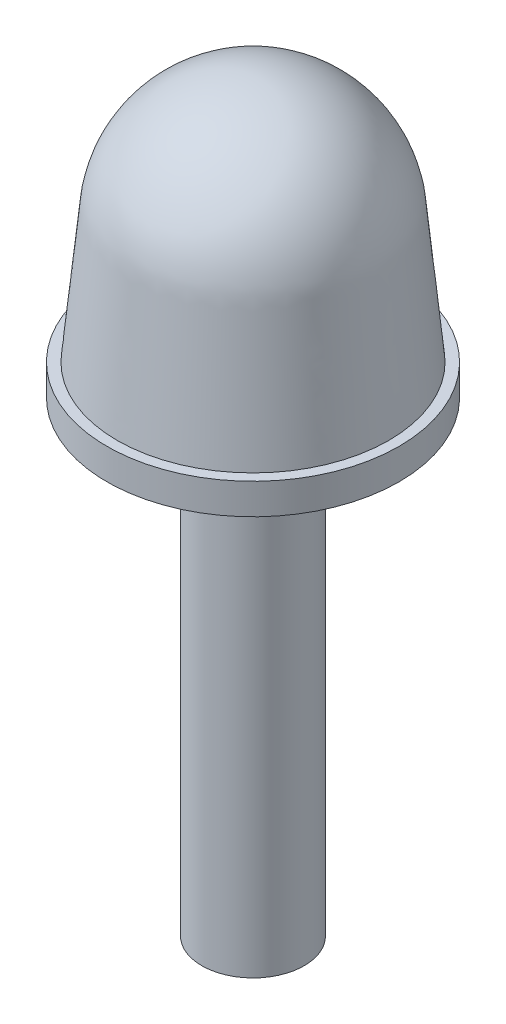
ISO-10303-21;
HEADER;
FILE_DESCRIPTION(('STEP AP214'),'2;1');
FILE_NAME('part.step','',(''),(''),'','','');
FILE_SCHEMA(('AUTOMOTIVE_DESIGN { 1 0 10303 214 1 1 1 1 }'));
ENDSEC;
DATA;
#1=APPLICATION_CONTEXT('core data for automotive mechanical design processes');
#2=APPLICATION_PROTOCOL_DEFINITION('international standard','automotive_design',2000,#1);
#3=PRODUCT_CONTEXT('',#1,'mechanical');
#4=PRODUCT('Part','Part','',(#3));
#5=PRODUCT_RELATED_PRODUCT_CATEGORY('part','',(#4));
#6=PRODUCT_DEFINITION_FORMATION('','',#4);
#7=PRODUCT_DEFINITION_CONTEXT('part definition',#1,'design');
#8=PRODUCT_DEFINITION('design','',#6,#7);
#9=PRODUCT_DEFINITION_SHAPE('','',#8);
#10=(LENGTH_UNIT() NAMED_UNIT(*) SI_UNIT(.MILLI.,.METRE.));
#11=(NAMED_UNIT(*) PLANE_ANGLE_UNIT() SI_UNIT($,.RADIAN.));
#12=(NAMED_UNIT(*) SI_UNIT($,.STERADIAN.) SOLID_ANGLE_UNIT());
#13=UNCERTAINTY_MEASURE_WITH_UNIT(LENGTH_MEASURE(1.E-05),#10,'distance_accuracy_value','');
#14=(GEOMETRIC_REPRESENTATION_CONTEXT(3) GLOBAL_UNCERTAINTY_ASSIGNED_CONTEXT((#13)) GLOBAL_UNIT_ASSIGNED_CONTEXT((#10,
#11,#12)) REPRESENTATION_CONTEXT('',''));
#15=CARTESIAN_POINT('',(0.,0.,0.));
#16=DIRECTION('',(0.,0.,1.));
#17=DIRECTION('',(1.,0.,0.));
#18=AXIS2_PLACEMENT_3D('',#15,#16,#17);
#19=CARTESIAN_POINT('',(13.25,-24.,0.));
#20=CARTESIAN_POINT('',(12.8762888931904,-20.234768096144,0.));
#21=CARTESIAN_POINT('',(12.5025777863808,-16.4695361922879,0.));
#22=CARTESIAN_POINT('',(12.1288666795712,-12.7043042884319,0.));
#23=CARTESIAN_POINT('',(12.1080288298059,-12.4943577941634,0.));
#24=CARTESIAN_POINT('',(12.0663531302754,-12.0744648056265,0.));
#25=CARTESIAN_POINT('',(12.0038395809797,-11.4446253228211,0.));
#26=CARTESIAN_POINT('',(11.9621638814492,-11.0247323342841,0.));
#27=CARTESIAN_POINT('',(11.9413260316839,-10.8147858400157,0.));
#28=CARTESIAN_POINT('',(11.9136003956724,-10.535443194418,0.));
#29=CARTESIAN_POINT('',(11.8581491236493,-9.97675790322282,0.));
#30=CARTESIAN_POINT('',(11.6665551392833,-9.1489857320982,0.));
#31=CARTESIAN_POINT('',(11.5141248420591,-8.60828507300223,0.));
#32=CARTESIAN_POINT('',(11.4285286542079,-8.34093826234789,0.));
#33=CARTESIAN_POINT('',(9.77905012195439,-3.18904031091958,0.));
#34=CARTESIAN_POINT('',(5.40951309549189,0.,0.));
#35=CARTESIAN_POINT('',(1.74198293753745E-13,0.,0.));
#36=(BOUNDED_CURVE() B_SPLINE_CURVE(3,(#19,#20,#21,#22,#23,#24,#25,#26,#27,#28,#29,#30,#31,#32,
#33,#34,#35),.UNSPECIFIED.,.F.,.F.) B_SPLINE_CURVE_WITH_KNOTS((4,3,1,1,3,1,1,3,4),(0.,
0.379321245469799,0.400471912340112,0.421622579210425,0.442773246080738,0.47091509841456,
0.499056950748383,0.527198803082205,1.),
.UNSPECIFIED.) CURVE() GEOMETRIC_REPRESENTATION_ITEM() RATIONAL_B_SPLINE_CURVE((1.,1.,1.,1.,1.,
1.,1.,1.,1.,1.,1.,1.,1.,1.,0.871833681310322,0.871833681310322,1.)) REPRESENTATION_ITEM(''));
#37=CARTESIAN_POINT('',(1.74198293753745E-13,0.,0.));
#38=DIRECTION('',(0.,1.,0.));
#39=AXIS1_PLACEMENT('',#37,#38);
#40=SURFACE_OF_REVOLUTION('',#36,#39);
#41=CARTESIAN_POINT('',(1.74198293753745E-13,0.,0.));
#42=VERTEX_POINT('',#41);
#43=VERTEX_LOOP('',#42);
#44=FACE_BOUND('',#43,.T.);
#45=CARTESIAN_POINT('',(1.19471804001493E-13,-24.,0.));
#46=DIRECTION('',(0.,1.,0.));
#47=DIRECTION('',(-1.,0.,0.));
#48=AXIS2_PLACEMENT_3D('',#45,#46,#47);
#49=CIRCLE('',#48,13.2499999999999);
#50=CARTESIAN_POINT('',(-13.2499999999998,-23.9999999999999,0.));
#51=VERTEX_POINT('',#50);
#52=EDGE_CURVE('E11',#51,#51,#49,.T.);
#53=ORIENTED_EDGE('',*,*,#52,.T.);
#54=EDGE_LOOP('',(#53));
#55=FACE_BOUND('',#54,.T.);
#56=ADVANCED_FACE('F33',(#44,#55),#40,.T.);
#57=CARTESIAN_POINT('',(13.25,-24.,0.));
#58=DIRECTION('',(0.,-1.,0.));
#59=DIRECTION('',(1.,0.,0.));
#60=AXIS2_PLACEMENT_3D('',#57,#58,#59);
#61=PLANE('',#60);
#62=ORIENTED_EDGE('',*,*,#52,.F.);
#63=EDGE_LOOP('',(#62));
#64=FACE_BOUND('',#63,.T.);
#65=CARTESIAN_POINT('',(1.19471804001493E-13,-24.,0.));
#66=DIRECTION('',(0.,1.,0.));
#67=DIRECTION('',(-1.,0.,0.));
#68=AXIS2_PLACEMENT_3D('',#65,#66,#67);
#69=CIRCLE('',#68,14.2499999999999);
#70=CARTESIAN_POINT('',(-14.2499999999998,-23.9999999999999,0.));
#71=VERTEX_POINT('',#70);
#72=EDGE_CURVE('E40',#71,#71,#69,.T.);
#73=ORIENTED_EDGE('',*,*,#72,.T.);
#74=EDGE_LOOP('',(#73));
#75=FACE_BOUND('',#74,.T.);
#76=ADVANCED_FACE('F45',(#64,#75),#61,.F.);
#77=CARTESIAN_POINT('',(1.74198293753745E-13,0.,0.));
#78=DIRECTION('',(0.,1.,0.));
#79=DIRECTION('',(-1.,0.,0.));
#80=AXIS2_PLACEMENT_3D('',#77,#78,#79);
#81=CYLINDRICAL_SURFACE('',#80,14.2499999999999);
#82=ORIENTED_EDGE('',*,*,#72,.F.);
#83=EDGE_LOOP('',(#82));
#84=FACE_BOUND('',#83,.T.);
#85=CARTESIAN_POINT('',(1.12630992782462E-13,-27.,0.));
#86=DIRECTION('',(0.,1.,0.));
#87=DIRECTION('',(-1.,0.,0.));
#88=AXIS2_PLACEMENT_3D('',#85,#86,#87);
#89=CIRCLE('',#88,14.2499999999999);
#90=CARTESIAN_POINT('',(-14.2499999999998,-26.9999999999999,0.));
#91=VERTEX_POINT('',#90);
#92=EDGE_CURVE('E54',#91,#91,#89,.T.);
#93=ORIENTED_EDGE('',*,*,#92,.T.);
#94=EDGE_LOOP('',(#93));
#95=FACE_BOUND('',#94,.T.);
#96=ADVANCED_FACE('F50',(#84,#95),#81,.T.);
#97=CARTESIAN_POINT('',(14.25,-27.,0.));
#98=DIRECTION('',(0.,1.,0.));
#99=DIRECTION('',(-1.,0.,0.));
#100=AXIS2_PLACEMENT_3D('',#97,#98,#99);
#101=PLANE('',#100);
#102=ORIENTED_EDGE('',*,*,#92,.F.);
#103=EDGE_LOOP('',(#102));
#104=FACE_BOUND('',#103,.T.);
#105=CARTESIAN_POINT('',(1.12630992782462E-13,-27.,0.));
#106=DIRECTION('',(0.,1.,0.));
#107=DIRECTION('',(-1.,0.,0.));
#108=AXIS2_PLACEMENT_3D('',#105,#106,#107);
#109=CIRCLE('',#108,8.99999999999989);
#110=CARTESIAN_POINT('',(-8.99999999999978,-27.,0.));
#111=VERTEX_POINT('',#110);
#112=EDGE_CURVE('E56',#111,#111,#109,.T.);
#113=ORIENTED_EDGE('',*,*,#112,.T.);
#114=EDGE_LOOP('',(#113));
#115=FACE_BOUND('',#114,.T.);
#116=ADVANCED_FACE('F95',(#104,#115),#101,.F.);
#117=CARTESIAN_POINT('',(1.74198293753745E-13,0.,0.));
#118=DIRECTION('',(0.,1.,0.));
#119=DIRECTION('',(-1.,0.,0.));
#120=AXIS2_PLACEMENT_3D('',#117,#118,#119);
#121=CYLINDRICAL_SURFACE('',#120,8.99999999999989);
#122=ORIENTED_EDGE('',*,*,#112,.F.);
#123=EDGE_LOOP('',(#122));
#124=FACE_BOUND('',#123,.T.);
#125=CARTESIAN_POINT('',(1.0579018156343E-13,-30.,0.));
#126=DIRECTION('',(0.,1.,0.));
#127=DIRECTION('',(-1.,0.,0.));
#128=AXIS2_PLACEMENT_3D('',#125,#126,#127);
#129=CIRCLE('',#128,8.9999999999999);
#130=CARTESIAN_POINT('',(-8.99999999999979,-30.,0.));
#131=VERTEX_POINT('',#130);
#132=EDGE_CURVE('E61',#131,#131,#129,.T.);
#133=ORIENTED_EDGE('',*,*,#132,.T.);
#134=EDGE_LOOP('',(#133));
#135=FACE_BOUND('',#134,.T.);
#136=ADVANCED_FACE('F91',(#124,#135),#121,.T.);
#137=CARTESIAN_POINT('',(9.,-30.,0.));
#138=DIRECTION('',(0.,1.,0.));
#139=DIRECTION('',(-1.,0.,0.));
#140=AXIS2_PLACEMENT_3D('',#137,#138,#139);
#141=PLANE('',#140);
#142=ORIENTED_EDGE('',*,*,#132,.F.);
#143=EDGE_LOOP('',(#142));
#144=FACE_BOUND('',#143,.T.);
#145=CARTESIAN_POINT('',(1.0579018156343E-13,-30.,0.));
#146=DIRECTION('',(0.,1.,0.));
#147=DIRECTION('',(-1.,0.,0.));
#148=AXIS2_PLACEMENT_3D('',#145,#146,#147);
#149=CIRCLE('',#148,4.9999999999999);
#150=CARTESIAN_POINT('',(-4.99999999999979,-30.,0.));
#151=VERTEX_POINT('',#150);
#152=EDGE_CURVE('E64',#151,#151,#149,.T.);
#153=ORIENTED_EDGE('',*,*,#152,.T.);
#154=EDGE_LOOP('',(#153));
#155=FACE_BOUND('',#154,.T.);
#156=ADVANCED_FACE('F85',(#144,#155),#141,.F.);
#157=CARTESIAN_POINT('',(1.74198293753745E-13,0.,0.));
#158=DIRECTION('',(0.,1.,0.));
#159=DIRECTION('',(-1.,0.,0.));
#160=AXIS2_PLACEMENT_3D('',#157,#158,#159);
#161=CYLINDRICAL_SURFACE('',#160,4.99999999999995);
#162=ORIENTED_EDGE('',*,*,#152,.F.);
#163=EDGE_LOOP('',(#162));
#164=FACE_BOUND('',#163,.T.);
#165=CARTESIAN_POINT('',(0.,-72.5,0.));
#166=DIRECTION('',(0.,1.,0.));
#167=DIRECTION('',(-1.,0.,0.));
#168=AXIS2_PLACEMENT_3D('',#165,#166,#167);
#169=CIRCLE('',#168,5.);
#170=CARTESIAN_POINT('',(-4.99999999999999,-72.5,0.));
#171=VERTEX_POINT('',#170);
#172=EDGE_CURVE('E67',#171,#171,#169,.T.);
#173=ORIENTED_EDGE('',*,*,#172,.T.);
#174=EDGE_LOOP('',(#173));
#175=FACE_BOUND('',#174,.T.);
#176=ADVANCED_FACE('F77',(#164,#175),#161,.T.);
#177=CARTESIAN_POINT('',(5.00000000000001,-72.5,0.));
#178=DIRECTION('',(0.,1.,0.));
#179=DIRECTION('',(-1.,0.,0.));
#180=AXIS2_PLACEMENT_3D('',#177,#178,#179);
#181=PLANE('',#180);
#182=ORIENTED_EDGE('',*,*,#172,.F.);
#183=EDGE_LOOP('',(#182));
#184=FACE_BOUND('',#183,.T.);
#185=ADVANCED_FACE('F79',(#184),#181,.F.);
#186=CLOSED_SHELL('',(#56,#76,#96,#116,#136,#156,#176,#185));
#187=MANIFOLD_SOLID_BREP('B2',#186);
#188=ADVANCED_BREP_SHAPE_REPRESENTATION('',(#18,#187),#14);
#189=SHAPE_DEFINITION_REPRESENTATION(#9,#188);
ENDSEC;
END-ISO-10303-21;
